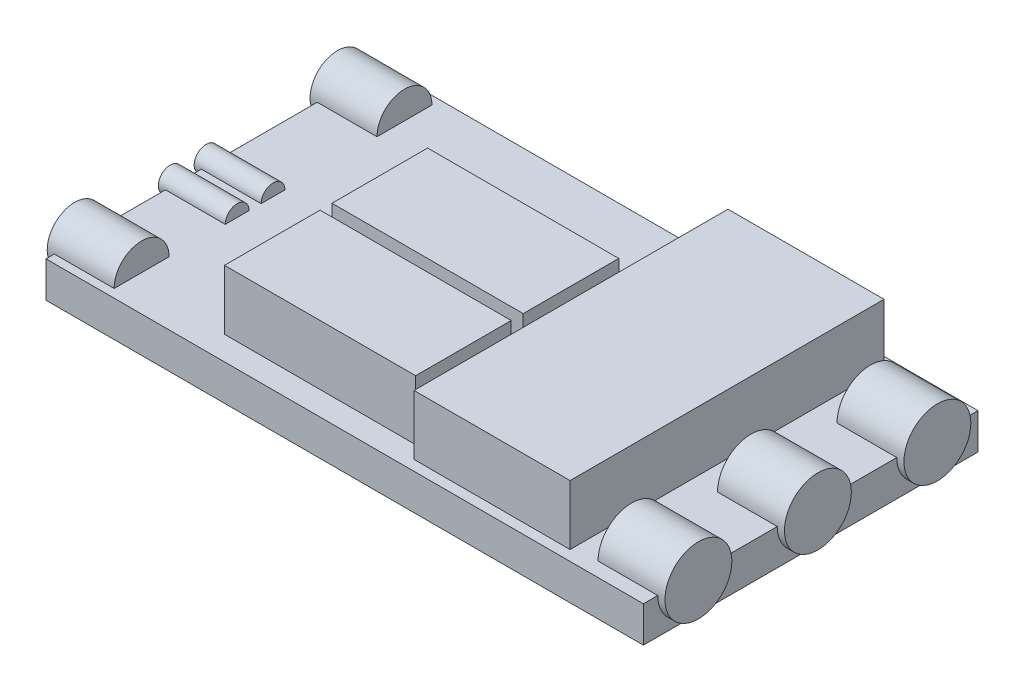
ISO-10303-21;
HEADER;
FILE_DESCRIPTION(('STEP AP214'),'2;1');
FILE_NAME('part.step','',(''),(''),'','','');
FILE_SCHEMA(('AUTOMOTIVE_DESIGN { 1 0 10303 214 1 1 1 1 }'));
ENDSEC;
DATA;
#1=APPLICATION_CONTEXT('core data for automotive mechanical design processes');
#2=APPLICATION_PROTOCOL_DEFINITION('international standard','automotive_design',2000,#1);
#3=PRODUCT_CONTEXT('',#1,'mechanical');
#4=PRODUCT('Part','Part','',(#3));
#5=PRODUCT_RELATED_PRODUCT_CATEGORY('part','',(#4));
#6=PRODUCT_DEFINITION_FORMATION('','',#4);
#7=PRODUCT_DEFINITION_CONTEXT('part definition',#1,'design');
#8=PRODUCT_DEFINITION('design','',#6,#7);
#9=PRODUCT_DEFINITION_SHAPE('','',#8);
#10=(LENGTH_UNIT() NAMED_UNIT(*) SI_UNIT(.MILLI.,.METRE.));
#11=(NAMED_UNIT(*) PLANE_ANGLE_UNIT() SI_UNIT($,.RADIAN.));
#12=(NAMED_UNIT(*) SI_UNIT($,.STERADIAN.) SOLID_ANGLE_UNIT());
#13=UNCERTAINTY_MEASURE_WITH_UNIT(LENGTH_MEASURE(1.E-05),#10,'distance_accuracy_value','');
#14=(GEOMETRIC_REPRESENTATION_CONTEXT(3) GLOBAL_UNCERTAINTY_ASSIGNED_CONTEXT((#13)) GLOBAL_UNIT_ASSIGNED_CONTEXT((#10,
#11,#12)) REPRESENTATION_CONTEXT('',''));
#15=CARTESIAN_POINT('',(0.,0.,0.));
#16=DIRECTION('',(0.,0.,1.));
#17=DIRECTION('',(1.,0.,0.));
#18=AXIS2_PLACEMENT_3D('',#15,#16,#17);
#19=CARTESIAN_POINT('',(0.,1.5,0.));
#20=DIRECTION('',(0.,-1.,0.));
#21=DIRECTION('',(0.,0.,-1.));
#22=AXIS2_PLACEMENT_3D('',#19,#20,#21);
#23=PLANE('',#22);
#24=DIRECTION('',(0.,0.,-1.));
#25=VECTOR('',#24,1.);
#26=CARTESIAN_POINT('',(1.96830437981669,1.5,1.5));
#27=LINE('',#26,#25);
#28=CARTESIAN_POINT('',(1.96830437981669,1.5,1.5));
#29=VERTEX_POINT('',#28);
#30=CARTESIAN_POINT('',(1.96830437981669,1.5,-2.5));
#31=VERTEX_POINT('',#30);
#32=EDGE_CURVE('E399',#29,#31,#27,.T.);
#33=ORIENTED_EDGE('',*,*,#32,.F.);
#34=DIRECTION('',(1.,0.,0.));
#35=VECTOR('',#34,1.);
#36=CARTESIAN_POINT('',(1.96830437981669,1.5,1.5));
#37=LINE('',#36,#35);
#38=CARTESIAN_POINT('',(-6.03169562018331,1.5,1.5));
#39=VERTEX_POINT('',#38);
#40=EDGE_CURVE('E389',#39,#29,#37,.T.);
#41=ORIENTED_EDGE('',*,*,#40,.F.);
#42=DIRECTION('',(0.,0.,1.));
#43=VECTOR('',#42,1.);
#44=CARTESIAN_POINT('',(-6.03169562018331,1.5,1.5));
#45=LINE('',#44,#43);
#46=CARTESIAN_POINT('',(-6.03169562018331,1.5,-2.5));
#47=VERTEX_POINT('',#46);
#48=EDGE_CURVE('E393',#47,#39,#45,.T.);
#49=ORIENTED_EDGE('',*,*,#48,.F.);
#50=DIRECTION('',(-1.,0.,0.));
#51=VECTOR('',#50,1.);
#52=CARTESIAN_POINT('',(1.96830437981669,1.5,-2.5));
#53=LINE('',#52,#51);
#54=EDGE_CURVE('E396',#31,#47,#53,.T.);
#55=ORIENTED_EDGE('',*,*,#54,.F.);
#56=EDGE_LOOP('',(#33,#41,#49,#55));
#57=FACE_BOUND('',#56,.T.);
#58=DIRECTION('',(0.,0.,-1.));
#59=VECTOR('',#58,1.);
#60=CARTESIAN_POINT('',(8.99902638474834,1.5,6.5692892608663));
#61=LINE('',#60,#59);
#62=CARTESIAN_POINT('',(8.99902638474834,1.5,6.5692892608663));
#63=VERTEX_POINT('',#62);
#64=CARTESIAN_POINT('',(8.99902638474834,1.5,-6.5692892608663));
#65=VERTEX_POINT('',#64);
#66=EDGE_CURVE('E333',#63,#65,#61,.T.);
#67=ORIENTED_EDGE('',*,*,#66,.F.);
#68=DIRECTION('',(1.,0.,0.));
#69=VECTOR('',#68,1.);
#70=CARTESIAN_POINT('',(2.46830437981669,1.5,6.5692892608663));
#71=LINE('',#70,#69);
#72=CARTESIAN_POINT('',(2.46830437981669,1.5,6.5692892608663));
#73=VERTEX_POINT('',#72);
#74=EDGE_CURVE('E323',#73,#63,#71,.T.);
#75=ORIENTED_EDGE('',*,*,#74,.F.);
#76=DIRECTION('',(0.,0.,1.));
#77=VECTOR('',#76,1.);
#78=CARTESIAN_POINT('',(2.46830437981669,1.5,6.5692892608663));
#79=LINE('',#78,#77);
#80=CARTESIAN_POINT('',(2.46830437981669,1.5,-6.5692892608663));
#81=VERTEX_POINT('',#80);
#82=EDGE_CURVE('E327',#81,#73,#79,.T.);
#83=ORIENTED_EDGE('',*,*,#82,.F.);
#84=DIRECTION('',(-1.,0.,0.));
#85=VECTOR('',#84,1.);
#86=CARTESIAN_POINT('',(2.46830437981669,1.5,-6.5692892608663));
#87=LINE('',#86,#85);
#88=EDGE_CURVE('E330',#65,#81,#87,.T.);
#89=ORIENTED_EDGE('',*,*,#88,.F.);
#90=EDGE_LOOP('',(#67,#75,#83,#89));
#91=FACE_BOUND('',#90,.T.);
#92=DIRECTION('',(0.,0.,-1.));
#93=VECTOR('',#92,1.);
#94=CARTESIAN_POINT('',(1.96830437981669,1.5,6.));
#95=LINE('',#94,#93);
#96=CARTESIAN_POINT('',(1.96830437981669,1.5,6.));
#97=VERTEX_POINT('',#96);
#98=CARTESIAN_POINT('',(1.96830437981669,1.5,2.));
#99=VERTEX_POINT('',#98);
#100=EDGE_CURVE('E366',#97,#99,#95,.T.);
#101=ORIENTED_EDGE('',*,*,#100,.F.);
#102=DIRECTION('',(1.,0.,0.));
#103=VECTOR('',#102,1.);
#104=CARTESIAN_POINT('',(1.96830437981669,1.5,6.));
#105=LINE('',#104,#103);
#106=CARTESIAN_POINT('',(-6.03169562018331,1.5,6.));
#107=VERTEX_POINT('',#106);
#108=EDGE_CURVE('E356',#107,#97,#105,.T.);
#109=ORIENTED_EDGE('',*,*,#108,.F.);
#110=DIRECTION('',(0.,0.,1.));
#111=VECTOR('',#110,1.);
#112=CARTESIAN_POINT('',(-6.03169562018331,1.5,6.));
#113=LINE('',#112,#111);
#114=CARTESIAN_POINT('',(-6.03169562018331,1.5,2.));
#115=VERTEX_POINT('',#114);
#116=EDGE_CURVE('E360',#115,#107,#113,.T.);
#117=ORIENTED_EDGE('',*,*,#116,.F.);
#118=DIRECTION('',(-1.,0.,0.));
#119=VECTOR('',#118,1.);
#120=CARTESIAN_POINT('',(1.96830437981669,1.5,2.));
#121=LINE('',#120,#119);
#122=EDGE_CURVE('E363',#99,#115,#121,.T.);
#123=ORIENTED_EDGE('',*,*,#122,.F.);
#124=EDGE_LOOP('',(#101,#109,#117,#123));
#125=FACE_BOUND('',#124,.T.);
#126=DIRECTION('',(1.,0.,0.));
#127=VECTOR('',#126,1.);
#128=CARTESIAN_POINT('',(-12.8,1.5,-0.5));
#129=LINE('',#128,#127);
#130=CARTESIAN_POINT('',(-10.,1.5,-0.5));
#131=VERTEX_POINT('',#130);
#132=CARTESIAN_POINT('',(-12.5,1.5,-0.5));
#133=VERTEX_POINT('',#132);
#134=EDGE_CURVE('E47',#131,#133,#129,.F.);
#135=ORIENTED_EDGE('',*,*,#134,.F.);
#136=DIRECTION('',(0.,0.,-1.));
#137=VECTOR('',#136,1.);
#138=CARTESIAN_POINT('',(-10.,1.5,0.));
#139=LINE('',#138,#137);
#140=CARTESIAN_POINT('',(-10.,1.5,0.5));
#141=VERTEX_POINT('',#140);
#142=EDGE_CURVE('E11',#141,#131,#139,.T.);
#143=ORIENTED_EDGE('',*,*,#142,.F.);
#144=DIRECTION('',(1.,0.,0.));
#145=VECTOR('',#144,1.);
#146=CARTESIAN_POINT('',(-12.8,1.5,0.5));
#147=LINE('',#146,#145);
#148=CARTESIAN_POINT('',(-12.5,1.5,0.5));
#149=VERTEX_POINT('',#148);
#150=EDGE_CURVE('E236',#149,#141,#147,.T.);
#151=ORIENTED_EDGE('',*,*,#150,.F.);
#152=DIRECTION('',(0.,0.,1.));
#153=VECTOR('',#152,1.);
#154=CARTESIAN_POINT('',(-12.5,1.5,7.));
#155=LINE('',#154,#153);
#156=CARTESIAN_POINT('',(-12.5,1.5,1.));
#157=VERTEX_POINT('',#156);
#158=EDGE_CURVE('E226',#149,#157,#155,.T.);
#159=ORIENTED_EDGE('',*,*,#158,.T.);
#160=DIRECTION('',(1.,0.,0.));
#161=VECTOR('',#160,1.);
#162=CARTESIAN_POINT('',(-12.8,1.5,1.));
#163=LINE('',#162,#161);
#164=CARTESIAN_POINT('',(-10.,1.5,1.));
#165=VERTEX_POINT('',#164);
#166=EDGE_CURVE('E469',#165,#157,#163,.F.);
#167=ORIENTED_EDGE('',*,*,#166,.F.);
#168=DIRECTION('',(0.,0.,-1.));
#169=VECTOR('',#168,1.);
#170=CARTESIAN_POINT('',(-10.,1.5,0.));
#171=LINE('',#170,#169);
#172=CARTESIAN_POINT('',(-10.,1.5,2.));
#173=VERTEX_POINT('',#172);
#174=EDGE_CURVE('E243',#173,#165,#171,.T.);
#175=ORIENTED_EDGE('',*,*,#174,.F.);
#176=DIRECTION('',(1.,0.,0.));
#177=VECTOR('',#176,1.);
#178=CARTESIAN_POINT('',(-12.8,1.5,2.));
#179=LINE('',#178,#177);
#180=CARTESIAN_POINT('',(-12.5,1.5,2.));
#181=VERTEX_POINT('',#180);
#182=EDGE_CURVE('E471',#181,#173,#179,.T.);
#183=ORIENTED_EDGE('',*,*,#182,.F.);
#184=CARTESIAN_POINT('',(-12.5,1.5,4.35));
#185=VERTEX_POINT('',#184);
#186=EDGE_CURVE('E233',#181,#185,#155,.T.);
#187=ORIENTED_EDGE('',*,*,#186,.T.);
#188=DIRECTION('',(1.,0.,0.));
#189=VECTOR('',#188,1.);
#190=CARTESIAN_POINT('',(-12.8,1.5,4.35));
#191=LINE('',#190,#189);
#192=CARTESIAN_POINT('',(-10.,1.5,4.35));
#193=VERTEX_POINT('',#192);
#194=EDGE_CURVE('E457',#193,#185,#191,.F.);
#195=ORIENTED_EDGE('',*,*,#194,.F.);
#196=DIRECTION('',(0.,0.,-1.));
#197=VECTOR('',#196,1.);
#198=CARTESIAN_POINT('',(-10.,1.5,0.));
#199=LINE('',#198,#197);
#200=CARTESIAN_POINT('',(-10.,1.5,6.65));
#201=VERTEX_POINT('',#200);
#202=EDGE_CURVE('E248',#201,#193,#199,.T.);
#203=ORIENTED_EDGE('',*,*,#202,.F.);
#204=DIRECTION('',(1.,0.,0.));
#205=VECTOR('',#204,1.);
#206=CARTESIAN_POINT('',(-12.8,1.5,6.65));
#207=LINE('',#206,#205);
#208=CARTESIAN_POINT('',(-12.5,1.5,6.65));
#209=VERTEX_POINT('',#208);
#210=EDGE_CURVE('E460',#209,#201,#207,.T.);
#211=ORIENTED_EDGE('',*,*,#210,.F.);
#212=CARTESIAN_POINT('',(-12.5,1.5,7.));
#213=VERTEX_POINT('',#212);
#214=EDGE_CURVE('E306',#209,#213,#155,.T.);
#215=ORIENTED_EDGE('',*,*,#214,.T.);
#216=DIRECTION('',(1.,0.,0.));
#217=VECTOR('',#216,1.);
#218=CARTESIAN_POINT('',(-12.5,1.5,7.));
#219=LINE('',#218,#217);
#220=CARTESIAN_POINT('',(12.5,1.5,7.));
#221=VERTEX_POINT('',#220);
#222=EDGE_CURVE('E290',#213,#221,#219,.T.);
#223=ORIENTED_EDGE('',*,*,#222,.T.);
#224=DIRECTION('',(0.,0.,-1.));
#225=VECTOR('',#224,1.);
#226=CARTESIAN_POINT('',(12.5,1.5,7.));
#227=LINE('',#226,#225);
#228=CARTESIAN_POINT('',(12.5,1.5,6.4));
#229=VERTEX_POINT('',#228);
#230=EDGE_CURVE('E307',#221,#229,#227,.T.);
#231=ORIENTED_EDGE('',*,*,#230,.T.);
#232=DIRECTION('',(-1.,0.,0.));
#233=VECTOR('',#232,1.);
#234=CARTESIAN_POINT('',(12.8,1.5,6.4));
#235=LINE('',#234,#233);
#236=CARTESIAN_POINT('',(10.,1.5,6.4));
#237=VERTEX_POINT('',#236);
#238=EDGE_CURVE('E402',#237,#229,#235,.F.);
#239=ORIENTED_EDGE('',*,*,#238,.F.);
#240=DIRECTION('',(0.,0.,1.));
#241=VECTOR('',#240,1.);
#242=CARTESIAN_POINT('',(10.,1.5,0.));
#243=LINE('',#242,#241);
#244=CARTESIAN_POINT('',(10.,1.5,3.6));
#245=VERTEX_POINT('',#244);
#246=EDGE_CURVE('E272',#245,#237,#243,.T.);
#247=ORIENTED_EDGE('',*,*,#246,.F.);
#248=DIRECTION('',(-1.,0.,0.));
#249=VECTOR('',#248,1.);
#250=CARTESIAN_POINT('',(12.8,1.5,3.6));
#251=LINE('',#250,#249);
#252=CARTESIAN_POINT('',(12.5,1.5,3.6));
#253=VERTEX_POINT('',#252);
#254=EDGE_CURVE('E412',#253,#245,#251,.T.);
#255=ORIENTED_EDGE('',*,*,#254,.F.);
#256=CARTESIAN_POINT('',(12.5,1.5,1.4));
#257=VERTEX_POINT('',#256);
#258=EDGE_CURVE('E310',#253,#257,#227,.T.);
#259=ORIENTED_EDGE('',*,*,#258,.T.);
#260=DIRECTION('',(-1.,0.,0.));
#261=VECTOR('',#260,1.);
#262=CARTESIAN_POINT('',(12.8,1.5,1.4));
#263=LINE('',#262,#261);
#264=CARTESIAN_POINT('',(10.,1.5,1.4));
#265=VERTEX_POINT('',#264);
#266=EDGE_CURVE('E421',#265,#257,#263,.F.);
#267=ORIENTED_EDGE('',*,*,#266,.F.);
#268=DIRECTION('',(0.,0.,1.));
#269=VECTOR('',#268,1.);
#270=CARTESIAN_POINT('',(10.,1.5,0.));
#271=LINE('',#270,#269);
#272=CARTESIAN_POINT('',(10.,1.5,-1.4));
#273=VERTEX_POINT('',#272);
#274=EDGE_CURVE('E266',#273,#265,#271,.T.);
#275=ORIENTED_EDGE('',*,*,#274,.F.);
#276=DIRECTION('',(-1.,0.,0.));
#277=VECTOR('',#276,1.);
#278=CARTESIAN_POINT('',(12.8,1.5,-1.4));
#279=LINE('',#278,#277);
#280=CARTESIAN_POINT('',(12.5,1.5,-1.4));
#281=VERTEX_POINT('',#280);
#282=EDGE_CURVE('E424',#281,#273,#279,.T.);
#283=ORIENTED_EDGE('',*,*,#282,.F.);
#284=CARTESIAN_POINT('',(12.5,1.5,-3.6));
#285=VERTEX_POINT('',#284);
#286=EDGE_CURVE('E544',#281,#285,#227,.T.);
#287=ORIENTED_EDGE('',*,*,#286,.T.);
#288=DIRECTION('',(-1.,0.,0.));
#289=VECTOR('',#288,1.);
#290=CARTESIAN_POINT('',(12.8,1.5,-3.6));
#291=LINE('',#290,#289);
#292=CARTESIAN_POINT('',(10.,1.5,-3.6));
#293=VERTEX_POINT('',#292);
#294=EDGE_CURVE('E433',#293,#285,#291,.F.);
#295=ORIENTED_EDGE('',*,*,#294,.F.);
#296=DIRECTION('',(0.,0.,1.));
#297=VECTOR('',#296,1.);
#298=CARTESIAN_POINT('',(10.,1.5,0.));
#299=LINE('',#298,#297);
#300=CARTESIAN_POINT('',(10.,1.5,-6.4));
#301=VERTEX_POINT('',#300);
#302=EDGE_CURVE('E260',#301,#293,#299,.T.);
#303=ORIENTED_EDGE('',*,*,#302,.F.);
#304=DIRECTION('',(-1.,0.,0.));
#305=VECTOR('',#304,1.);
#306=CARTESIAN_POINT('',(12.8,1.5,-6.4));
#307=LINE('',#306,#305);
#308=CARTESIAN_POINT('',(12.5,1.5,-6.4));
#309=VERTEX_POINT('',#308);
#310=EDGE_CURVE('E436',#309,#301,#307,.T.);
#311=ORIENTED_EDGE('',*,*,#310,.F.);
#312=CARTESIAN_POINT('',(12.5,1.5,-7.));
#313=VERTEX_POINT('',#312);
#314=EDGE_CURVE('E293',#309,#313,#227,.T.);
#315=ORIENTED_EDGE('',*,*,#314,.T.);
#316=DIRECTION('',(-1.,0.,0.));
#317=VECTOR('',#316,1.);
#318=CARTESIAN_POINT('',(-12.5,1.5,-7.));
#319=LINE('',#318,#317);
#320=CARTESIAN_POINT('',(-12.5,1.5,-7.));
#321=VERTEX_POINT('',#320);
#322=EDGE_CURVE('E304',#313,#321,#319,.T.);
#323=ORIENTED_EDGE('',*,*,#322,.T.);
#324=CARTESIAN_POINT('',(-12.5,1.5,-6.65));
#325=VERTEX_POINT('',#324);
#326=EDGE_CURVE('E235',#321,#325,#155,.T.);
#327=ORIENTED_EDGE('',*,*,#326,.T.);
#328=DIRECTION('',(1.,0.,0.));
#329=VECTOR('',#328,1.);
#330=CARTESIAN_POINT('',(-12.8,1.5,-6.65));
#331=LINE('',#330,#329);
#332=CARTESIAN_POINT('',(-10.,1.5,-6.65));
#333=VERTEX_POINT('',#332);
#334=EDGE_CURVE('E445',#333,#325,#331,.F.);
#335=ORIENTED_EDGE('',*,*,#334,.F.);
#336=DIRECTION('',(0.,0.,-1.));
#337=VECTOR('',#336,1.);
#338=CARTESIAN_POINT('',(-10.,1.5,0.));
#339=LINE('',#338,#337);
#340=CARTESIAN_POINT('',(-10.,1.5,-4.35));
#341=VERTEX_POINT('',#340);
#342=EDGE_CURVE('E254',#341,#333,#339,.T.);
#343=ORIENTED_EDGE('',*,*,#342,.F.);
#344=DIRECTION('',(1.,0.,0.));
#345=VECTOR('',#344,1.);
#346=CARTESIAN_POINT('',(-12.8,1.5,-4.35));
#347=LINE('',#346,#345);
#348=CARTESIAN_POINT('',(-12.5,1.5,-4.35));
#349=VERTEX_POINT('',#348);
#350=EDGE_CURVE('E448',#349,#341,#347,.T.);
#351=ORIENTED_EDGE('',*,*,#350,.F.);
#352=EDGE_CURVE('E232',#349,#133,#155,.T.);
#353=ORIENTED_EDGE('',*,*,#352,.T.);
#354=EDGE_LOOP('',(#135,#143,#151,#159,#167,#175,#183,#187,#195,#203,#211,#215,#223,#231,#239,
#247,#255,#259,#267,#275,#283,#287,#295,#303,#311,#315,#323,#327,#335,#343,#351,#353));
#355=FACE_BOUND('',#354,.T.);
#356=ADVANCED_FACE('F32',(#57,#91,#125,#355),#23,.F.);
#357=CARTESIAN_POINT('',(12.5,1.5,7.));
#358=DIRECTION('',(-1.,0.,0.));
#359=DIRECTION('',(0.,0.,1.));
#360=AXIS2_PLACEMENT_3D('',#357,#358,#359);
#361=PLANE('',#360);
#362=CARTESIAN_POINT('',(12.5,1.5,-5.));
#363=DIRECTION('',(-1.,0.,0.));
#364=DIRECTION('',(0.,0.,1.));
#365=AXIS2_PLACEMENT_3D('',#362,#363,#364);
#366=CIRCLE('',#365,1.4);
#367=EDGE_CURVE('E263',#285,#309,#366,.F.);
#368=ORIENTED_EDGE('',*,*,#367,.F.);
#369=ORIENTED_EDGE('',*,*,#286,.F.);
#370=CARTESIAN_POINT('',(12.5,1.5,0.));
#371=DIRECTION('',(-1.,0.,0.));
#372=DIRECTION('',(0.,0.,1.));
#373=AXIS2_PLACEMENT_3D('',#370,#371,#372);
#374=CIRCLE('',#373,1.4);
#375=EDGE_CURVE('E269',#257,#281,#374,.F.);
#376=ORIENTED_EDGE('',*,*,#375,.F.);
#377=ORIENTED_EDGE('',*,*,#258,.F.);
#378=CARTESIAN_POINT('',(12.5,1.5,5.));
#379=DIRECTION('',(-1.,0.,0.));
#380=DIRECTION('',(0.,0.,1.));
#381=AXIS2_PLACEMENT_3D('',#378,#379,#380);
#382=CIRCLE('',#381,1.4);
#383=EDGE_CURVE('E275',#229,#253,#382,.F.);
#384=ORIENTED_EDGE('',*,*,#383,.F.);
#385=ORIENTED_EDGE('',*,*,#230,.F.);
#386=DIRECTION('',(0.,-1.,0.));
#387=VECTOR('',#386,1.);
#388=CARTESIAN_POINT('',(12.5,1.5,7.));
#389=LINE('',#388,#387);
#390=CARTESIAN_POINT('',(12.5,0.,7.));
#391=VERTEX_POINT('',#390);
#392=EDGE_CURVE('E287',#221,#391,#389,.T.);
#393=ORIENTED_EDGE('',*,*,#392,.T.);
#394=DIRECTION('',(0.,0.,-1.));
#395=VECTOR('',#394,1.);
#396=CARTESIAN_POINT('',(12.5,0.,7.));
#397=LINE('',#396,#395);
#398=CARTESIAN_POINT('',(12.5,0.,-7.));
#399=VERTEX_POINT('',#398);
#400=EDGE_CURVE('E298',#391,#399,#397,.T.);
#401=ORIENTED_EDGE('',*,*,#400,.T.);
#402=DIRECTION('',(0.,-1.,0.));
#403=VECTOR('',#402,1.);
#404=CARTESIAN_POINT('',(12.5,1.5,-7.));
#405=LINE('',#404,#403);
#406=EDGE_CURVE('E278',#313,#399,#405,.T.);
#407=ORIENTED_EDGE('',*,*,#406,.F.);
#408=ORIENTED_EDGE('',*,*,#314,.F.);
#409=EDGE_LOOP('',(#368,#369,#376,#377,#384,#385,#393,#401,#407,#408));
#410=FACE_BOUND('',#409,.T.);
#411=ADVANCED_FACE('F34',(#410),#361,.F.);
#412=CARTESIAN_POINT('',(-12.5,1.5,-7.));
#413=DIRECTION('',(0.,0.,1.));
#414=DIRECTION('',(1.,0.,0.));
#415=AXIS2_PLACEMENT_3D('',#412,#413,#414);
#416=PLANE('',#415);
#417=DIRECTION('',(-1.,0.,0.));
#418=VECTOR('',#417,1.);
#419=CARTESIAN_POINT('',(-12.5,0.,-7.));
#420=LINE('',#419,#418);
#421=CARTESIAN_POINT('',(-12.5,0.,-7.));
#422=VERTEX_POINT('',#421);
#423=EDGE_CURVE('E296',#399,#422,#420,.T.);
#424=ORIENTED_EDGE('',*,*,#423,.T.);
#425=DIRECTION('',(0.,-1.,0.));
#426=VECTOR('',#425,1.);
#427=CARTESIAN_POINT('',(-12.5,1.5,-7.));
#428=LINE('',#427,#426);
#429=EDGE_CURVE('E281',#321,#422,#428,.T.);
#430=ORIENTED_EDGE('',*,*,#429,.F.);
#431=ORIENTED_EDGE('',*,*,#322,.F.);
#432=ORIENTED_EDGE('',*,*,#406,.T.);
#433=EDGE_LOOP('',(#424,#430,#431,#432));
#434=FACE_BOUND('',#433,.T.);
#435=ADVANCED_FACE('F506',(#434),#416,.F.);
#436=CARTESIAN_POINT('',(-12.5,1.5,7.));
#437=DIRECTION('',(1.,0.,0.));
#438=DIRECTION('',(0.,0.,-1.));
#439=AXIS2_PLACEMENT_3D('',#436,#437,#438);
#440=PLANE('',#439);
#441=CARTESIAN_POINT('',(-12.5,1.5,0.));
#442=DIRECTION('',(1.,0.,0.));
#443=DIRECTION('',(0.,0.,-1.));
#444=AXIS2_PLACEMENT_3D('',#441,#442,#443);
#445=CIRCLE('',#444,0.5);
#446=EDGE_CURVE('E40',#133,#149,#445,.F.);
#447=ORIENTED_EDGE('',*,*,#446,.F.);
#448=ORIENTED_EDGE('',*,*,#352,.F.);
#449=CARTESIAN_POINT('',(-12.5,1.5,-5.5));
#450=DIRECTION('',(1.,0.,0.));
#451=DIRECTION('',(0.,0.,-1.));
#452=AXIS2_PLACEMENT_3D('',#449,#450,#451);
#453=CIRCLE('',#452,1.15);
#454=EDGE_CURVE('E257',#325,#349,#453,.F.);
#455=ORIENTED_EDGE('',*,*,#454,.F.);
#456=ORIENTED_EDGE('',*,*,#326,.F.);
#457=ORIENTED_EDGE('',*,*,#429,.T.);
#458=DIRECTION('',(0.,0.,1.));
#459=VECTOR('',#458,1.);
#460=CARTESIAN_POINT('',(-12.5,0.,7.));
#461=LINE('',#460,#459);
#462=CARTESIAN_POINT('',(-12.5,0.,7.));
#463=VERTEX_POINT('',#462);
#464=EDGE_CURVE('E294',#422,#463,#461,.T.);
#465=ORIENTED_EDGE('',*,*,#464,.T.);
#466=DIRECTION('',(0.,-1.,0.));
#467=VECTOR('',#466,1.);
#468=CARTESIAN_POINT('',(-12.5,1.5,7.));
#469=LINE('',#468,#467);
#470=EDGE_CURVE('E284',#213,#463,#469,.T.);
#471=ORIENTED_EDGE('',*,*,#470,.F.);
#472=ORIENTED_EDGE('',*,*,#214,.F.);
#473=CARTESIAN_POINT('',(-12.5,1.5,5.5));
#474=DIRECTION('',(1.,0.,0.));
#475=DIRECTION('',(0.,0.,-1.));
#476=AXIS2_PLACEMENT_3D('',#473,#474,#475);
#477=CIRCLE('',#476,1.15);
#478=EDGE_CURVE('E251',#185,#209,#477,.F.);
#479=ORIENTED_EDGE('',*,*,#478,.F.);
#480=ORIENTED_EDGE('',*,*,#186,.F.);
#481=CARTESIAN_POINT('',(-12.5,1.5,1.5));
#482=DIRECTION('',(1.,0.,0.));
#483=DIRECTION('',(0.,0.,-1.));
#484=AXIS2_PLACEMENT_3D('',#481,#482,#483);
#485=CIRCLE('',#484,0.5);
#486=EDGE_CURVE('E230',#157,#181,#485,.F.);
#487=ORIENTED_EDGE('',*,*,#486,.F.);
#488=ORIENTED_EDGE('',*,*,#158,.F.);
#489=EDGE_LOOP('',(#447,#448,#455,#456,#457,#465,#471,#472,#479,#480,#487,#488));
#490=FACE_BOUND('',#489,.T.);
#491=ADVANCED_FACE('F227',(#490),#440,.F.);
#492=CARTESIAN_POINT('',(-12.5,1.5,7.));
#493=DIRECTION('',(0.,0.,-1.));
#494=DIRECTION('',(-1.,0.,0.));
#495=AXIS2_PLACEMENT_3D('',#492,#493,#494);
#496=PLANE('',#495);
#497=DIRECTION('',(1.,0.,0.));
#498=VECTOR('',#497,1.);
#499=CARTESIAN_POINT('',(-12.5,0.,7.));
#500=LINE('',#499,#498);
#501=EDGE_CURVE('E291',#463,#391,#500,.T.);
#502=ORIENTED_EDGE('',*,*,#501,.T.);
#503=ORIENTED_EDGE('',*,*,#392,.F.);
#504=ORIENTED_EDGE('',*,*,#222,.F.);
#505=ORIENTED_EDGE('',*,*,#470,.T.);
#506=EDGE_LOOP('',(#502,#503,#504,#505));
#507=FACE_BOUND('',#506,.T.);
#508=ADVANCED_FACE('F516',(#507),#496,.F.);
#509=CARTESIAN_POINT('',(0.,0.,0.));
#510=DIRECTION('',(0.,-1.,0.));
#511=DIRECTION('',(0.,0.,-1.));
#512=AXIS2_PLACEMENT_3D('',#509,#510,#511);
#513=PLANE('',#512);
#514=ORIENTED_EDGE('',*,*,#400,.F.);
#515=ORIENTED_EDGE('',*,*,#501,.F.);
#516=ORIENTED_EDGE('',*,*,#464,.F.);
#517=ORIENTED_EDGE('',*,*,#423,.F.);
#518=EDGE_LOOP('',(#514,#515,#516,#517));
#519=FACE_BOUND('',#518,.T.);
#520=ADVANCED_FACE('F513',(#519),#513,.T.);
#521=CARTESIAN_POINT('',(8.99902638474834,4.,6.5692892608663));
#522=DIRECTION('',(-1.,0.,0.));
#523=DIRECTION('',(0.,0.,1.));
#524=AXIS2_PLACEMENT_3D('',#521,#522,#523);
#525=PLANE('',#524);
#526=ORIENTED_EDGE('',*,*,#66,.T.);
#527=DIRECTION('',(0.,-1.,0.));
#528=VECTOR('',#527,1.);
#529=CARTESIAN_POINT('',(8.99902638474834,4.,-6.5692892608663));
#530=LINE('',#529,#528);
#531=CARTESIAN_POINT('',(8.99902638474834,4.,-6.5692892608663));
#532=VERTEX_POINT('',#531);
#533=EDGE_CURVE('E301',#532,#65,#530,.T.);
#534=ORIENTED_EDGE('',*,*,#533,.F.);
#535=DIRECTION('',(0.,0.,-1.));
#536=VECTOR('',#535,1.);
#537=CARTESIAN_POINT('',(8.99902638474834,4.,6.5692892608663));
#538=LINE('',#537,#536);
#539=CARTESIAN_POINT('',(8.99902638474834,4.,6.5692892608663));
#540=VERTEX_POINT('',#539);
#541=EDGE_CURVE('E326',#540,#532,#538,.T.);
#542=ORIENTED_EDGE('',*,*,#541,.F.);
#543=DIRECTION('',(0.,-1.,0.));
#544=VECTOR('',#543,1.);
#545=CARTESIAN_POINT('',(8.99902638474834,4.,6.5692892608663));
#546=LINE('',#545,#544);
#547=EDGE_CURVE('E319',#540,#63,#546,.T.);
#548=ORIENTED_EDGE('',*,*,#547,.T.);
#549=EDGE_LOOP('',(#526,#534,#542,#548));
#550=FACE_BOUND('',#549,.T.);
#551=ADVANCED_FACE('F511',(#550),#525,.F.);
#552=CARTESIAN_POINT('',(2.46830437981669,4.,-6.5692892608663));
#553=DIRECTION('',(0.,0.,1.));
#554=DIRECTION('',(1.,0.,0.));
#555=AXIS2_PLACEMENT_3D('',#552,#553,#554);
#556=PLANE('',#555);
#557=ORIENTED_EDGE('',*,*,#88,.T.);
#558=DIRECTION('',(0.,-1.,0.));
#559=VECTOR('',#558,1.);
#560=CARTESIAN_POINT('',(2.46830437981669,4.,-6.5692892608663));
#561=LINE('',#560,#559);
#562=CARTESIAN_POINT('',(2.46830437981669,4.,-6.5692892608663));
#563=VERTEX_POINT('',#562);
#564=EDGE_CURVE('E313',#563,#81,#561,.T.);
#565=ORIENTED_EDGE('',*,*,#564,.F.);
#566=DIRECTION('',(-1.,0.,0.));
#567=VECTOR('',#566,1.);
#568=CARTESIAN_POINT('',(2.46830437981669,4.,-6.5692892608663));
#569=LINE('',#568,#567);
#570=EDGE_CURVE('E340',#532,#563,#569,.T.);
#571=ORIENTED_EDGE('',*,*,#570,.F.);
#572=ORIENTED_EDGE('',*,*,#533,.T.);
#573=EDGE_LOOP('',(#557,#565,#571,#572));
#574=FACE_BOUND('',#573,.T.);
#575=ADVANCED_FACE('F672',(#574),#556,.F.);
#576=CARTESIAN_POINT('',(2.46830437981669,4.,6.5692892608663));
#577=DIRECTION('',(1.,0.,0.));
#578=DIRECTION('',(0.,0.,-1.));
#579=AXIS2_PLACEMENT_3D('',#576,#577,#578);
#580=PLANE('',#579);
#581=ORIENTED_EDGE('',*,*,#82,.T.);
#582=DIRECTION('',(0.,-1.,0.));
#583=VECTOR('',#582,1.);
#584=CARTESIAN_POINT('',(2.46830437981669,4.,6.5692892608663));
#585=LINE('',#584,#583);
#586=CARTESIAN_POINT('',(2.46830437981669,4.,6.5692892608663));
#587=VERTEX_POINT('',#586);
#588=EDGE_CURVE('E316',#587,#73,#585,.T.);
#589=ORIENTED_EDGE('',*,*,#588,.F.);
#590=DIRECTION('',(0.,0.,1.));
#591=VECTOR('',#590,1.);
#592=CARTESIAN_POINT('',(2.46830437981669,4.,6.5692892608663));
#593=LINE('',#592,#591);
#594=EDGE_CURVE('E338',#563,#587,#593,.T.);
#595=ORIENTED_EDGE('',*,*,#594,.F.);
#596=ORIENTED_EDGE('',*,*,#564,.T.);
#597=EDGE_LOOP('',(#581,#589,#595,#596));
#598=FACE_BOUND('',#597,.T.);
#599=ADVANCED_FACE('F669',(#598),#580,.F.);
#600=CARTESIAN_POINT('',(2.46830437981669,4.,6.5692892608663));
#601=DIRECTION('',(0.,0.,-1.));
#602=DIRECTION('',(-1.,0.,0.));
#603=AXIS2_PLACEMENT_3D('',#600,#601,#602);
#604=PLANE('',#603);
#605=ORIENTED_EDGE('',*,*,#74,.T.);
#606=ORIENTED_EDGE('',*,*,#547,.F.);
#607=DIRECTION('',(1.,0.,0.));
#608=VECTOR('',#607,1.);
#609=CARTESIAN_POINT('',(2.46830437981669,4.,6.5692892608663));
#610=LINE('',#609,#608);
#611=EDGE_CURVE('E322',#587,#540,#610,.T.);
#612=ORIENTED_EDGE('',*,*,#611,.F.);
#613=ORIENTED_EDGE('',*,*,#588,.T.);
#614=EDGE_LOOP('',(#605,#606,#612,#613));
#615=FACE_BOUND('',#614,.T.);
#616=ADVANCED_FACE('F665',(#615),#604,.F.);
#617=CARTESIAN_POINT('',(0.,4.,0.));
#618=DIRECTION('',(0.,-1.,0.));
#619=DIRECTION('',(0.,0.,-1.));
#620=AXIS2_PLACEMENT_3D('',#617,#618,#619);
#621=PLANE('',#620);
#622=ORIENTED_EDGE('',*,*,#541,.T.);
#623=ORIENTED_EDGE('',*,*,#570,.T.);
#624=ORIENTED_EDGE('',*,*,#594,.T.);
#625=ORIENTED_EDGE('',*,*,#611,.T.);
#626=EDGE_LOOP('',(#622,#623,#624,#625));
#627=FACE_BOUND('',#626,.T.);
#628=ADVANCED_FACE('F661',(#627),#621,.F.);
#629=CARTESIAN_POINT('',(1.96830437981669,4.,6.));
#630=DIRECTION('',(-1.,0.,0.));
#631=DIRECTION('',(0.,0.,1.));
#632=AXIS2_PLACEMENT_3D('',#629,#630,#631);
#633=PLANE('',#632);
#634=ORIENTED_EDGE('',*,*,#100,.T.);
#635=DIRECTION('',(0.,-1.,0.));
#636=VECTOR('',#635,1.);
#637=CARTESIAN_POINT('',(1.96830437981669,4.,2.));
#638=LINE('',#637,#636);
#639=CARTESIAN_POINT('',(1.96830437981669,4.,2.));
#640=VERTEX_POINT('',#639);
#641=EDGE_CURVE('E336',#640,#99,#638,.T.);
#642=ORIENTED_EDGE('',*,*,#641,.F.);
#643=DIRECTION('',(0.,0.,-1.));
#644=VECTOR('',#643,1.);
#645=CARTESIAN_POINT('',(1.96830437981669,4.,6.));
#646=LINE('',#645,#644);
#647=CARTESIAN_POINT('',(1.96830437981669,4.,6.));
#648=VERTEX_POINT('',#647);
#649=EDGE_CURVE('E359',#648,#640,#646,.T.);
#650=ORIENTED_EDGE('',*,*,#649,.F.);
#651=DIRECTION('',(0.,-1.,0.));
#652=VECTOR('',#651,1.);
#653=CARTESIAN_POINT('',(1.96830437981669,4.,6.));
#654=LINE('',#653,#652);
#655=EDGE_CURVE('E352',#648,#97,#654,.T.);
#656=ORIENTED_EDGE('',*,*,#655,.T.);
#657=EDGE_LOOP('',(#634,#642,#650,#656));
#658=FACE_BOUND('',#657,.T.);
#659=ADVANCED_FACE('F657',(#658),#633,.F.);
#660=CARTESIAN_POINT('',(1.96830437981669,4.,2.));
#661=DIRECTION('',(0.,0.,1.));
#662=DIRECTION('',(1.,0.,0.));
#663=AXIS2_PLACEMENT_3D('',#660,#661,#662);
#664=PLANE('',#663);
#665=ORIENTED_EDGE('',*,*,#122,.T.);
#666=DIRECTION('',(0.,-1.,0.));
#667=VECTOR('',#666,1.);
#668=CARTESIAN_POINT('',(-6.03169562018331,4.,2.));
#669=LINE('',#668,#667);
#670=CARTESIAN_POINT('',(-6.03169562018331,4.,2.));
#671=VERTEX_POINT('',#670);
#672=EDGE_CURVE('E346',#671,#115,#669,.T.);
#673=ORIENTED_EDGE('',*,*,#672,.F.);
#674=DIRECTION('',(-1.,0.,0.));
#675=VECTOR('',#674,1.);
#676=CARTESIAN_POINT('',(1.96830437981669,4.,2.));
#677=LINE('',#676,#675);
#678=EDGE_CURVE('E373',#640,#671,#677,.T.);
#679=ORIENTED_EDGE('',*,*,#678,.F.);
#680=ORIENTED_EDGE('',*,*,#641,.T.);
#681=EDGE_LOOP('',(#665,#673,#679,#680));
#682=FACE_BOUND('',#681,.T.);
#683=ADVANCED_FACE('F653',(#682),#664,.F.);
#684=CARTESIAN_POINT('',(-6.03169562018331,4.,6.));
#685=DIRECTION('',(1.,0.,0.));
#686=DIRECTION('',(0.,0.,-1.));
#687=AXIS2_PLACEMENT_3D('',#684,#685,#686);
#688=PLANE('',#687);
#689=ORIENTED_EDGE('',*,*,#116,.T.);
#690=DIRECTION('',(0.,-1.,0.));
#691=VECTOR('',#690,1.);
#692=CARTESIAN_POINT('',(-6.03169562018331,4.,6.));
#693=LINE('',#692,#691);
#694=CARTESIAN_POINT('',(-6.03169562018331,4.,6.));
#695=VERTEX_POINT('',#694);
#696=EDGE_CURVE('E349',#695,#107,#693,.T.);
#697=ORIENTED_EDGE('',*,*,#696,.F.);
#698=DIRECTION('',(0.,0.,1.));
#699=VECTOR('',#698,1.);
#700=CARTESIAN_POINT('',(-6.03169562018331,4.,6.));
#701=LINE('',#700,#699);
#702=EDGE_CURVE('E371',#671,#695,#701,.T.);
#703=ORIENTED_EDGE('',*,*,#702,.F.);
#704=ORIENTED_EDGE('',*,*,#672,.T.);
#705=EDGE_LOOP('',(#689,#697,#703,#704));
#706=FACE_BOUND('',#705,.T.);
#707=ADVANCED_FACE('F649',(#706),#688,.F.);
#708=CARTESIAN_POINT('',(1.96830437981669,4.,6.));
#709=DIRECTION('',(0.,0.,-1.));
#710=DIRECTION('',(-1.,0.,0.));
#711=AXIS2_PLACEMENT_3D('',#708,#709,#710);
#712=PLANE('',#711);
#713=ORIENTED_EDGE('',*,*,#108,.T.);
#714=ORIENTED_EDGE('',*,*,#655,.F.);
#715=DIRECTION('',(1.,0.,0.));
#716=VECTOR('',#715,1.);
#717=CARTESIAN_POINT('',(1.96830437981669,4.,6.));
#718=LINE('',#717,#716);
#719=EDGE_CURVE('E355',#695,#648,#718,.T.);
#720=ORIENTED_EDGE('',*,*,#719,.F.);
#721=ORIENTED_EDGE('',*,*,#696,.T.);
#722=EDGE_LOOP('',(#713,#714,#720,#721));
#723=FACE_BOUND('',#722,.T.);
#724=ADVANCED_FACE('F645',(#723),#712,.F.);
#725=CARTESIAN_POINT('',(0.,4.,0.));
#726=DIRECTION('',(0.,1.,0.));
#727=DIRECTION('',(0.,0.,1.));
#728=AXIS2_PLACEMENT_3D('',#725,#726,#727);
#729=PLANE('',#728);
#730=ORIENTED_EDGE('',*,*,#649,.T.);
#731=ORIENTED_EDGE('',*,*,#678,.T.);
#732=ORIENTED_EDGE('',*,*,#702,.T.);
#733=ORIENTED_EDGE('',*,*,#719,.T.);
#734=EDGE_LOOP('',(#730,#731,#732,#733));
#735=FACE_BOUND('',#734,.T.);
#736=ADVANCED_FACE('F641',(#735),#729,.T.);
#737=CARTESIAN_POINT('',(1.96830437981669,4.,1.5));
#738=DIRECTION('',(-1.,0.,0.));
#739=DIRECTION('',(0.,0.,1.));
#740=AXIS2_PLACEMENT_3D('',#737,#738,#739);
#741=PLANE('',#740);
#742=ORIENTED_EDGE('',*,*,#32,.T.);
#743=DIRECTION('',(0.,-1.,0.));
#744=VECTOR('',#743,1.);
#745=CARTESIAN_POINT('',(1.96830437981669,4.,-2.5));
#746=LINE('',#745,#744);
#747=CARTESIAN_POINT('',(1.96830437981669,4.,-2.5));
#748=VERTEX_POINT('',#747);
#749=EDGE_CURVE('E369',#748,#31,#746,.T.);
#750=ORIENTED_EDGE('',*,*,#749,.F.);
#751=DIRECTION('',(0.,0.,-1.));
#752=VECTOR('',#751,1.);
#753=CARTESIAN_POINT('',(1.96830437981669,4.,1.5));
#754=LINE('',#753,#752);
#755=CARTESIAN_POINT('',(1.96830437981669,4.,1.5));
#756=VERTEX_POINT('',#755);
#757=EDGE_CURVE('E392',#756,#748,#754,.T.);
#758=ORIENTED_EDGE('',*,*,#757,.F.);
#759=DIRECTION('',(0.,-1.,0.));
#760=VECTOR('',#759,1.);
#761=CARTESIAN_POINT('',(1.96830437981669,4.,1.5));
#762=LINE('',#761,#760);
#763=EDGE_CURVE('E385',#756,#29,#762,.T.);
#764=ORIENTED_EDGE('',*,*,#763,.T.);
#765=EDGE_LOOP('',(#742,#750,#758,#764));
#766=FACE_BOUND('',#765,.T.);
#767=ADVANCED_FACE('F637',(#766),#741,.F.);
#768=CARTESIAN_POINT('',(1.96830437981669,4.,-2.5));
#769=DIRECTION('',(0.,0.,1.));
#770=DIRECTION('',(1.,0.,0.));
#771=AXIS2_PLACEMENT_3D('',#768,#769,#770);
#772=PLANE('',#771);
#773=ORIENTED_EDGE('',*,*,#54,.T.);
#774=DIRECTION('',(0.,-1.,0.));
#775=VECTOR('',#774,1.);
#776=CARTESIAN_POINT('',(-6.03169562018331,4.,-2.5));
#777=LINE('',#776,#775);
#778=CARTESIAN_POINT('',(-6.03169562018331,4.,-2.5));
#779=VERTEX_POINT('',#778);
#780=EDGE_CURVE('E379',#779,#47,#777,.T.);
#781=ORIENTED_EDGE('',*,*,#780,.F.);
#782=DIRECTION('',(-1.,0.,0.));
#783=VECTOR('',#782,1.);
#784=CARTESIAN_POINT('',(1.96830437981669,4.,-2.5));
#785=LINE('',#784,#783);
#786=EDGE_CURVE('E406',#748,#779,#785,.T.);
#787=ORIENTED_EDGE('',*,*,#786,.F.);
#788=ORIENTED_EDGE('',*,*,#749,.T.);
#789=EDGE_LOOP('',(#773,#781,#787,#788));
#790=FACE_BOUND('',#789,.T.);
#791=ADVANCED_FACE('F633',(#790),#772,.F.);
#792=CARTESIAN_POINT('',(-6.03169562018331,4.,1.5));
#793=DIRECTION('',(1.,0.,0.));
#794=DIRECTION('',(0.,0.,-1.));
#795=AXIS2_PLACEMENT_3D('',#792,#793,#794);
#796=PLANE('',#795);
#797=ORIENTED_EDGE('',*,*,#48,.T.);
#798=DIRECTION('',(0.,-1.,0.));
#799=VECTOR('',#798,1.);
#800=CARTESIAN_POINT('',(-6.03169562018331,4.,1.5));
#801=LINE('',#800,#799);
#802=CARTESIAN_POINT('',(-6.03169562018331,4.,1.5));
#803=VERTEX_POINT('',#802);
#804=EDGE_CURVE('E382',#803,#39,#801,.T.);
#805=ORIENTED_EDGE('',*,*,#804,.F.);
#806=DIRECTION('',(0.,0.,1.));
#807=VECTOR('',#806,1.);
#808=CARTESIAN_POINT('',(-6.03169562018331,4.,1.5));
#809=LINE('',#808,#807);
#810=EDGE_CURVE('E404',#779,#803,#809,.T.);
#811=ORIENTED_EDGE('',*,*,#810,.F.);
#812=ORIENTED_EDGE('',*,*,#780,.T.);
#813=EDGE_LOOP('',(#797,#805,#811,#812));
#814=FACE_BOUND('',#813,.T.);
#815=ADVANCED_FACE('F629',(#814),#796,.F.);
#816=CARTESIAN_POINT('',(1.96830437981669,4.,1.5));
#817=DIRECTION('',(0.,0.,-1.));
#818=DIRECTION('',(-1.,0.,0.));
#819=AXIS2_PLACEMENT_3D('',#816,#817,#818);
#820=PLANE('',#819);
#821=ORIENTED_EDGE('',*,*,#40,.T.);
#822=ORIENTED_EDGE('',*,*,#763,.F.);
#823=DIRECTION('',(1.,0.,0.));
#824=VECTOR('',#823,1.);
#825=CARTESIAN_POINT('',(1.96830437981669,4.,1.5));
#826=LINE('',#825,#824);
#827=EDGE_CURVE('E388',#803,#756,#826,.T.);
#828=ORIENTED_EDGE('',*,*,#827,.F.);
#829=ORIENTED_EDGE('',*,*,#804,.T.);
#830=EDGE_LOOP('',(#821,#822,#828,#829));
#831=FACE_BOUND('',#830,.T.);
#832=ADVANCED_FACE('F625',(#831),#820,.F.);
#833=CARTESIAN_POINT('',(0.,4.,0.));
#834=DIRECTION('',(0.,1.,0.));
#835=DIRECTION('',(0.,0.,1.));
#836=AXIS2_PLACEMENT_3D('',#833,#834,#835);
#837=PLANE('',#836);
#838=ORIENTED_EDGE('',*,*,#757,.T.);
#839=ORIENTED_EDGE('',*,*,#786,.T.);
#840=ORIENTED_EDGE('',*,*,#810,.T.);
#841=ORIENTED_EDGE('',*,*,#827,.T.);
#842=EDGE_LOOP('',(#838,#839,#840,#841));
#843=FACE_BOUND('',#842,.T.);
#844=ADVANCED_FACE('F616',(#843),#837,.T.);
#845=CARTESIAN_POINT('',(10.,1.5,5.));
#846=DIRECTION('',(1.,0.,0.));
#847=DIRECTION('',(0.,0.,-1.));
#848=AXIS2_PLACEMENT_3D('',#845,#846,#847);
#849=PLANE('',#848);
#850=CARTESIAN_POINT('',(10.,1.5,5.));
#851=DIRECTION('',(1.,0.,0.));
#852=DIRECTION('',(0.,0.,-1.));
#853=AXIS2_PLACEMENT_3D('',#850,#851,#852);
#854=CIRCLE('',#853,1.4);
#855=EDGE_CURVE('E418',#245,#237,#854,.T.);
#856=ORIENTED_EDGE('',*,*,#855,.F.);
#857=ORIENTED_EDGE('',*,*,#246,.T.);
#858=EDGE_LOOP('',(#856,#857));
#859=FACE_BOUND('',#858,.T.);
#860=ADVANCED_FACE('F542',(#859),#849,.F.);
#861=CARTESIAN_POINT('',(12.8,1.5,5.));
#862=DIRECTION('',(-1.,0.,0.));
#863=DIRECTION('',(0.,0.,1.));
#864=AXIS2_PLACEMENT_3D('',#861,#862,#863);
#865=CYLINDRICAL_SURFACE('',#864,1.4);
#866=CARTESIAN_POINT('',(12.8,1.5,5.));
#867=DIRECTION('',(1.,0.,0.));
#868=DIRECTION('',(0.,0.,-1.));
#869=AXIS2_PLACEMENT_3D('',#866,#867,#868);
#870=CIRCLE('',#869,1.4);
#871=CARTESIAN_POINT('',(12.8,1.5,3.6));
#872=VERTEX_POINT('',#871);
#873=EDGE_CURVE('E415',#872,#872,#870,.T.);
#874=ORIENTED_EDGE('',*,*,#873,.F.);
#875=EDGE_LOOP('',(#874));
#876=FACE_BOUND('',#875,.T.);
#877=ORIENTED_EDGE('',*,*,#855,.T.);
#878=ORIENTED_EDGE('',*,*,#238,.T.);
#879=ORIENTED_EDGE('',*,*,#383,.T.);
#880=ORIENTED_EDGE('',*,*,#254,.T.);
#881=EDGE_LOOP('',(#877,#878,#879,#880));
#882=FACE_BOUND('',#881,.T.);
#883=ADVANCED_FACE('F538',(#876,#882),#865,.T.);
#884=CARTESIAN_POINT('',(12.8,1.5,5.));
#885=DIRECTION('',(1.,0.,0.));
#886=DIRECTION('',(0.,0.,-1.));
#887=AXIS2_PLACEMENT_3D('',#884,#885,#886);
#888=PLANE('',#887);
#889=ORIENTED_EDGE('',*,*,#873,.T.);
#890=EDGE_LOOP('',(#889));
#891=FACE_BOUND('',#890,.T.);
#892=ADVANCED_FACE('F607',(#891),#888,.T.);
#893=CARTESIAN_POINT('',(10.,1.5,0.));
#894=DIRECTION('',(1.,0.,0.));
#895=DIRECTION('',(0.,0.,-1.));
#896=AXIS2_PLACEMENT_3D('',#893,#894,#895);
#897=PLANE('',#896);
#898=CARTESIAN_POINT('',(10.,1.5,0.));
#899=DIRECTION('',(1.,0.,0.));
#900=DIRECTION('',(0.,0.,-1.));
#901=AXIS2_PLACEMENT_3D('',#898,#899,#900);
#902=CIRCLE('',#901,1.4);
#903=EDGE_CURVE('E430',#273,#265,#902,.T.);
#904=ORIENTED_EDGE('',*,*,#903,.F.);
#905=ORIENTED_EDGE('',*,*,#274,.T.);
#906=EDGE_LOOP('',(#904,#905));
#907=FACE_BOUND('',#906,.T.);
#908=ADVANCED_FACE('F550',(#907),#897,.F.);
#909=CARTESIAN_POINT('',(12.8,1.5,0.));
#910=DIRECTION('',(-1.,0.,0.));
#911=DIRECTION('',(0.,0.,1.));
#912=AXIS2_PLACEMENT_3D('',#909,#910,#911);
#913=CYLINDRICAL_SURFACE('',#912,1.4);
#914=CARTESIAN_POINT('',(12.8,1.5,0.));
#915=DIRECTION('',(1.,0.,0.));
#916=DIRECTION('',(0.,0.,-1.));
#917=AXIS2_PLACEMENT_3D('',#914,#915,#916);
#918=CIRCLE('',#917,1.4);
#919=CARTESIAN_POINT('',(12.8,1.5,-1.4));
#920=VERTEX_POINT('',#919);
#921=EDGE_CURVE('E427',#920,#920,#918,.T.);
#922=ORIENTED_EDGE('',*,*,#921,.F.);
#923=EDGE_LOOP('',(#922));
#924=FACE_BOUND('',#923,.T.);
#925=ORIENTED_EDGE('',*,*,#903,.T.);
#926=ORIENTED_EDGE('',*,*,#266,.T.);
#927=ORIENTED_EDGE('',*,*,#375,.T.);
#928=ORIENTED_EDGE('',*,*,#282,.T.);
#929=EDGE_LOOP('',(#925,#926,#927,#928));
#930=FACE_BOUND('',#929,.T.);
#931=ADVANCED_FACE('F546',(#924,#930),#913,.T.);
#932=CARTESIAN_POINT('',(12.8,1.5,0.));
#933=DIRECTION('',(1.,0.,0.));
#934=DIRECTION('',(0.,0.,-1.));
#935=AXIS2_PLACEMENT_3D('',#932,#933,#934);
#936=PLANE('',#935);
#937=ORIENTED_EDGE('',*,*,#921,.T.);
#938=EDGE_LOOP('',(#937));
#939=FACE_BOUND('',#938,.T.);
#940=ADVANCED_FACE('F598',(#939),#936,.T.);
#941=CARTESIAN_POINT('',(10.,1.5,-5.));
#942=DIRECTION('',(1.,0.,0.));
#943=DIRECTION('',(0.,0.,-1.));
#944=AXIS2_PLACEMENT_3D('',#941,#942,#943);
#945=PLANE('',#944);
#946=CARTESIAN_POINT('',(10.,1.5,-5.));
#947=DIRECTION('',(1.,0.,0.));
#948=DIRECTION('',(0.,0.,-1.));
#949=AXIS2_PLACEMENT_3D('',#946,#947,#948);
#950=CIRCLE('',#949,1.4);
#951=EDGE_CURVE('E442',#301,#293,#950,.T.);
#952=ORIENTED_EDGE('',*,*,#951,.F.);
#953=ORIENTED_EDGE('',*,*,#302,.T.);
#954=EDGE_LOOP('',(#952,#953));
#955=FACE_BOUND('',#954,.T.);
#956=ADVANCED_FACE('F557',(#955),#945,.F.);
#957=CARTESIAN_POINT('',(12.8,1.5,-5.));
#958=DIRECTION('',(-1.,0.,0.));
#959=DIRECTION('',(0.,0.,1.));
#960=AXIS2_PLACEMENT_3D('',#957,#958,#959);
#961=CYLINDRICAL_SURFACE('',#960,1.4);
#962=CARTESIAN_POINT('',(12.8,1.5,-5.));
#963=DIRECTION('',(1.,0.,0.));
#964=DIRECTION('',(0.,0.,-1.));
#965=AXIS2_PLACEMENT_3D('',#962,#963,#964);
#966=CIRCLE('',#965,1.4);
#967=CARTESIAN_POINT('',(12.8,1.5,-6.4));
#968=VERTEX_POINT('',#967);
#969=EDGE_CURVE('E439',#968,#968,#966,.T.);
#970=ORIENTED_EDGE('',*,*,#969,.F.);
#971=EDGE_LOOP('',(#970));
#972=FACE_BOUND('',#971,.T.);
#973=ORIENTED_EDGE('',*,*,#951,.T.);
#974=ORIENTED_EDGE('',*,*,#294,.T.);
#975=ORIENTED_EDGE('',*,*,#367,.T.);
#976=ORIENTED_EDGE('',*,*,#310,.T.);
#977=EDGE_LOOP('',(#973,#974,#975,#976));
#978=FACE_BOUND('',#977,.T.);
#979=ADVANCED_FACE('F553',(#972,#978),#961,.T.);
#980=CARTESIAN_POINT('',(12.8,1.5,-5.));
#981=DIRECTION('',(1.,0.,0.));
#982=DIRECTION('',(0.,0.,-1.));
#983=AXIS2_PLACEMENT_3D('',#980,#981,#982);
#984=PLANE('',#983);
#985=ORIENTED_EDGE('',*,*,#969,.T.);
#986=EDGE_LOOP('',(#985));
#987=FACE_BOUND('',#986,.T.);
#988=ADVANCED_FACE('F591',(#987),#984,.T.);
#989=CARTESIAN_POINT('',(-10.,1.5,-5.5));
#990=DIRECTION('',(-1.,0.,0.));
#991=DIRECTION('',(0.,0.,1.));
#992=AXIS2_PLACEMENT_3D('',#989,#990,#991);
#993=PLANE('',#992);
#994=CARTESIAN_POINT('',(-10.,1.5,-5.5));
#995=DIRECTION('',(-1.,0.,0.));
#996=DIRECTION('',(0.,0.,1.));
#997=AXIS2_PLACEMENT_3D('',#994,#995,#996);
#998=CIRCLE('',#997,1.15);
#999=EDGE_CURVE('E454',#341,#333,#998,.T.);
#1000=ORIENTED_EDGE('',*,*,#999,.F.);
#1001=ORIENTED_EDGE('',*,*,#342,.T.);
#1002=EDGE_LOOP('',(#1000,#1001));
#1003=FACE_BOUND('',#1002,.T.);
#1004=ADVANCED_FACE('F563',(#1003),#993,.F.);
#1005=CARTESIAN_POINT('',(-12.8,1.5,-5.5));
#1006=DIRECTION('',(1.,0.,0.));
#1007=DIRECTION('',(0.,0.,-1.));
#1008=AXIS2_PLACEMENT_3D('',#1005,#1006,#1007);
#1009=CYLINDRICAL_SURFACE('',#1008,1.15);
#1010=CARTESIAN_POINT('',(-12.8,1.5,-5.5));
#1011=DIRECTION('',(-1.,0.,0.));
#1012=DIRECTION('',(0.,0.,1.));
#1013=AXIS2_PLACEMENT_3D('',#1010,#1011,#1012);
#1014=CIRCLE('',#1013,1.15);
#1015=CARTESIAN_POINT('',(-12.8,1.5,-4.35));
#1016=VERTEX_POINT('',#1015);
#1017=EDGE_CURVE('E451',#1016,#1016,#1014,.T.);
#1018=ORIENTED_EDGE('',*,*,#1017,.F.);
#1019=EDGE_LOOP('',(#1018));
#1020=FACE_BOUND('',#1019,.T.);
#1021=ORIENTED_EDGE('',*,*,#999,.T.);
#1022=ORIENTED_EDGE('',*,*,#334,.T.);
#1023=ORIENTED_EDGE('',*,*,#454,.T.);
#1024=ORIENTED_EDGE('',*,*,#350,.T.);
#1025=EDGE_LOOP('',(#1021,#1022,#1023,#1024));
#1026=FACE_BOUND('',#1025,.T.);
#1027=ADVANCED_FACE('F559',(#1020,#1026),#1009,.T.);
#1028=CARTESIAN_POINT('',(-12.8,1.5,-5.5));
#1029=DIRECTION('',(-1.,0.,0.));
#1030=DIRECTION('',(0.,0.,1.));
#1031=AXIS2_PLACEMENT_3D('',#1028,#1029,#1030);
#1032=PLANE('',#1031);
#1033=ORIENTED_EDGE('',*,*,#1017,.T.);
#1034=EDGE_LOOP('',(#1033));
#1035=FACE_BOUND('',#1034,.T.);
#1036=ADVANCED_FACE('F573',(#1035),#1032,.T.);
#1037=CARTESIAN_POINT('',(-10.,1.5,5.5));
#1038=DIRECTION('',(-1.,0.,0.));
#1039=DIRECTION('',(0.,0.,1.));
#1040=AXIS2_PLACEMENT_3D('',#1037,#1038,#1039);
#1041=PLANE('',#1040);
#1042=CARTESIAN_POINT('',(-10.,1.5,5.5));
#1043=DIRECTION('',(-1.,0.,0.));
#1044=DIRECTION('',(0.,0.,1.));
#1045=AXIS2_PLACEMENT_3D('',#1042,#1043,#1044);
#1046=CIRCLE('',#1045,1.15);
#1047=EDGE_CURVE('E466',#201,#193,#1046,.T.);
#1048=ORIENTED_EDGE('',*,*,#1047,.F.);
#1049=ORIENTED_EDGE('',*,*,#202,.T.);
#1050=EDGE_LOOP('',(#1048,#1049));
#1051=FACE_BOUND('',#1050,.T.);
#1052=ADVANCED_FACE('F571',(#1051),#1041,.F.);
#1053=CARTESIAN_POINT('',(-12.8,1.5,5.5));
#1054=DIRECTION('',(1.,0.,0.));
#1055=DIRECTION('',(0.,0.,-1.));
#1056=AXIS2_PLACEMENT_3D('',#1053,#1054,#1055);
#1057=CYLINDRICAL_SURFACE('',#1056,1.15);
#1058=CARTESIAN_POINT('',(-12.8,1.5,5.5));
#1059=DIRECTION('',(-1.,0.,0.));
#1060=DIRECTION('',(0.,0.,1.));
#1061=AXIS2_PLACEMENT_3D('',#1058,#1059,#1060);
#1062=CIRCLE('',#1061,1.15);
#1063=CARTESIAN_POINT('',(-12.8,1.5,6.65));
#1064=VERTEX_POINT('',#1063);
#1065=EDGE_CURVE('E463',#1064,#1064,#1062,.T.);
#1066=ORIENTED_EDGE('',*,*,#1065,.F.);
#1067=EDGE_LOOP('',(#1066));
#1068=FACE_BOUND('',#1067,.T.);
#1069=ORIENTED_EDGE('',*,*,#1047,.T.);
#1070=ORIENTED_EDGE('',*,*,#194,.T.);
#1071=ORIENTED_EDGE('',*,*,#478,.T.);
#1072=ORIENTED_EDGE('',*,*,#210,.T.);
#1073=EDGE_LOOP('',(#1069,#1070,#1071,#1072));
#1074=FACE_BOUND('',#1073,.T.);
#1075=ADVANCED_FACE('F568',(#1068,#1074),#1057,.T.);
#1076=CARTESIAN_POINT('',(-12.8,1.5,5.5));
#1077=DIRECTION('',(-1.,0.,0.));
#1078=DIRECTION('',(0.,0.,1.));
#1079=AXIS2_PLACEMENT_3D('',#1076,#1077,#1078);
#1080=PLANE('',#1079);
#1081=ORIENTED_EDGE('',*,*,#1065,.T.);
#1082=EDGE_LOOP('',(#1081));
#1083=FACE_BOUND('',#1082,.T.);
#1084=ADVANCED_FACE('F579',(#1083),#1080,.T.);
#1085=CARTESIAN_POINT('',(-10.,1.5,1.5));
#1086=DIRECTION('',(-1.,0.,0.));
#1087=DIRECTION('',(0.,0.,1.));
#1088=AXIS2_PLACEMENT_3D('',#1085,#1086,#1087);
#1089=PLANE('',#1088);
#1090=CARTESIAN_POINT('',(-10.,1.5,1.5));
#1091=DIRECTION('',(-1.,0.,0.));
#1092=DIRECTION('',(0.,0.,1.));
#1093=AXIS2_PLACEMENT_3D('',#1090,#1091,#1092);
#1094=CIRCLE('',#1093,0.5);
#1095=EDGE_CURVE('E477',#173,#165,#1094,.T.);
#1096=ORIENTED_EDGE('',*,*,#1095,.F.);
#1097=ORIENTED_EDGE('',*,*,#174,.T.);
#1098=EDGE_LOOP('',(#1096,#1097));
#1099=FACE_BOUND('',#1098,.T.);
#1100=ADVANCED_FACE('F587',(#1099),#1089,.F.);
#1101=CARTESIAN_POINT('',(-12.8,1.5,1.5));
#1102=DIRECTION('',(1.,0.,0.));
#1103=DIRECTION('',(0.,0.,-1.));
#1104=AXIS2_PLACEMENT_3D('',#1101,#1102,#1103);
#1105=CYLINDRICAL_SURFACE('',#1104,0.5);
#1106=CARTESIAN_POINT('',(-12.8,1.5,1.5));
#1107=DIRECTION('',(-1.,0.,0.));
#1108=DIRECTION('',(0.,0.,1.));
#1109=AXIS2_PLACEMENT_3D('',#1106,#1107,#1108);
#1110=CIRCLE('',#1109,0.5);
#1111=CARTESIAN_POINT('',(-12.8,1.5,2.));
#1112=VERTEX_POINT('',#1111);
#1113=EDGE_CURVE('E474',#1112,#1112,#1110,.T.);
#1114=ORIENTED_EDGE('',*,*,#1113,.F.);
#1115=EDGE_LOOP('',(#1114));
#1116=FACE_BOUND('',#1115,.T.);
#1117=ORIENTED_EDGE('',*,*,#1095,.T.);
#1118=ORIENTED_EDGE('',*,*,#166,.T.);
#1119=ORIENTED_EDGE('',*,*,#486,.T.);
#1120=ORIENTED_EDGE('',*,*,#182,.T.);
#1121=EDGE_LOOP('',(#1117,#1118,#1119,#1120));
#1122=FACE_BOUND('',#1121,.T.);
#1123=ADVANCED_FACE('F496',(#1116,#1122),#1105,.T.);
#1124=CARTESIAN_POINT('',(-12.8,1.5,1.5));
#1125=DIRECTION('',(-1.,0.,0.));
#1126=DIRECTION('',(0.,0.,1.));
#1127=AXIS2_PLACEMENT_3D('',#1124,#1125,#1126);
#1128=PLANE('',#1127);
#1129=ORIENTED_EDGE('',*,*,#1113,.T.);
#1130=EDGE_LOOP('',(#1129));
#1131=FACE_BOUND('',#1130,.T.);
#1132=ADVANCED_FACE('F487',(#1131),#1128,.T.);
#1133=CARTESIAN_POINT('',(-10.,1.5,0.));
#1134=DIRECTION('',(-1.,0.,0.));
#1135=DIRECTION('',(0.,0.,1.));
#1136=AXIS2_PLACEMENT_3D('',#1133,#1134,#1135);
#1137=PLANE('',#1136);
#1138=CARTESIAN_POINT('',(-10.,1.5,0.));
#1139=DIRECTION('',(-1.,0.,0.));
#1140=DIRECTION('',(0.,0.,1.));
#1141=AXIS2_PLACEMENT_3D('',#1138,#1139,#1140);
#1142=CIRCLE('',#1141,0.5);
#1143=EDGE_CURVE('E483',#141,#131,#1142,.T.);
#1144=ORIENTED_EDGE('',*,*,#1143,.F.);
#1145=ORIENTED_EDGE('',*,*,#142,.T.);
#1146=EDGE_LOOP('',(#1144,#1145));
#1147=FACE_BOUND('',#1146,.T.);
#1148=ADVANCED_FACE('F485',(#1147),#1137,.F.);
#1149=CARTESIAN_POINT('',(-12.8,1.5,0.));
#1150=DIRECTION('',(1.,0.,0.));
#1151=DIRECTION('',(0.,0.,-1.));
#1152=AXIS2_PLACEMENT_3D('',#1149,#1150,#1151);
#1153=CYLINDRICAL_SURFACE('',#1152,0.5);
#1154=CARTESIAN_POINT('',(-12.8,1.5,0.));
#1155=DIRECTION('',(-1.,0.,0.));
#1156=DIRECTION('',(0.,0.,1.));
#1157=AXIS2_PLACEMENT_3D('',#1154,#1155,#1156);
#1158=CIRCLE('',#1157,0.5);
#1159=CARTESIAN_POINT('',(-12.8,1.5,0.5));
#1160=VERTEX_POINT('',#1159);
#1161=EDGE_CURVE('E240',#1160,#1160,#1158,.T.);
#1162=ORIENTED_EDGE('',*,*,#1161,.F.);
#1163=EDGE_LOOP('',(#1162));
#1164=FACE_BOUND('',#1163,.T.);
#1165=ORIENTED_EDGE('',*,*,#1143,.T.);
#1166=ORIENTED_EDGE('',*,*,#134,.T.);
#1167=ORIENTED_EDGE('',*,*,#446,.T.);
#1168=ORIENTED_EDGE('',*,*,#150,.T.);
#1169=EDGE_LOOP('',(#1165,#1166,#1167,#1168));
#1170=FACE_BOUND('',#1169,.T.);
#1171=ADVANCED_FACE('F242',(#1164,#1170),#1153,.T.);
#1172=CARTESIAN_POINT('',(-12.8,1.5,0.));
#1173=DIRECTION('',(-1.,0.,0.));
#1174=DIRECTION('',(0.,0.,1.));
#1175=AXIS2_PLACEMENT_3D('',#1172,#1173,#1174);
#1176=PLANE('',#1175);
#1177=ORIENTED_EDGE('',*,*,#1161,.T.);
#1178=EDGE_LOOP('',(#1177));
#1179=FACE_BOUND('',#1178,.T.);
#1180=ADVANCED_FACE('F493',(#1179),#1176,.T.);
#1181=CLOSED_SHELL('',(#356,#411,#435,#491,#508,#520,#551,#575,#599,#616,#628,#659,#683,#707,
#724,#736,#767,#791,#815,#832,#844,#860,#883,#892,#908,#931,#940,#956,#979,#988,#1004,#1027,
#1036,#1052,#1075,#1084,#1100,#1123,#1132,#1148,#1171,#1180));
#1182=MANIFOLD_SOLID_BREP('B2',#1181);
#1183=ADVANCED_BREP_SHAPE_REPRESENTATION('',(#18,#1182),#14);
#1184=SHAPE_DEFINITION_REPRESENTATION(#9,#1183);
ENDSEC;
END-ISO-10303-21;
